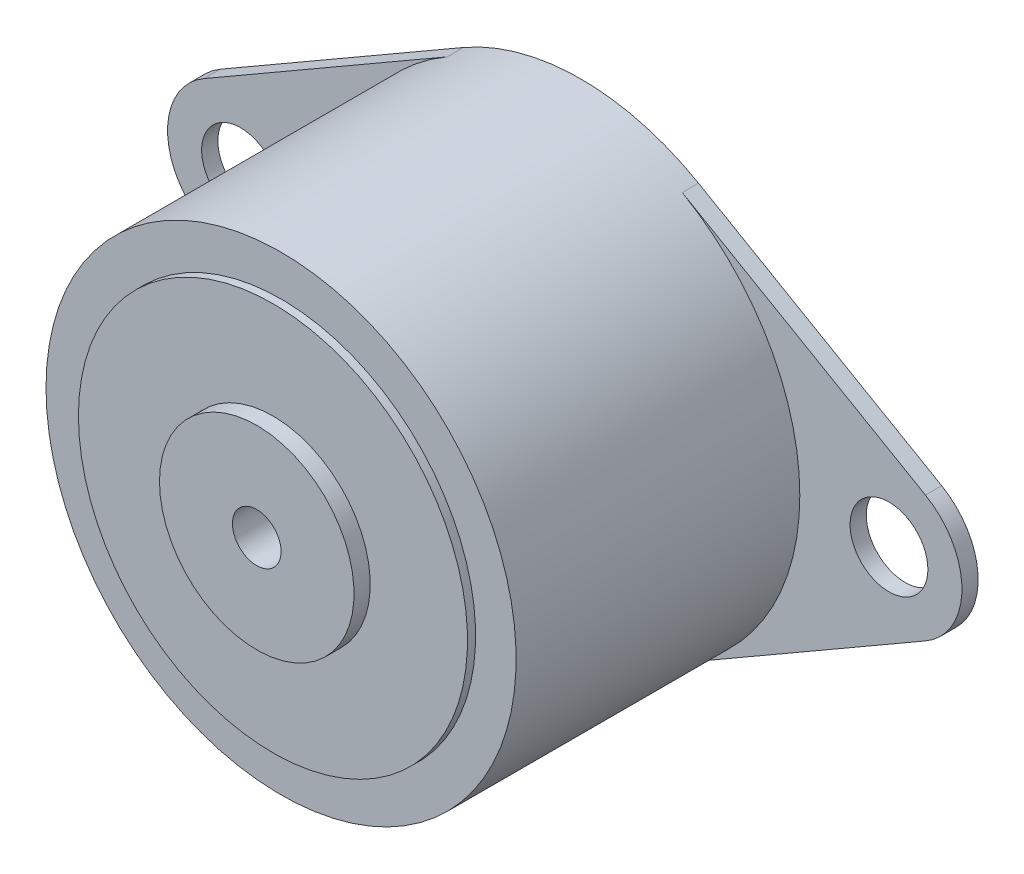
ISO-10303-21;
HEADER;
FILE_DESCRIPTION(('STEP AP214'),'2;1');
FILE_NAME('part.step','',(''),(''),'','','');
FILE_SCHEMA(('AUTOMOTIVE_DESIGN { 1 0 10303 214 1 1 1 1 }'));
ENDSEC;
DATA;
#1=APPLICATION_CONTEXT('core data for automotive mechanical design processes');
#2=APPLICATION_PROTOCOL_DEFINITION('international standard','automotive_design',2000,#1);
#3=PRODUCT_CONTEXT('',#1,'mechanical');
#4=PRODUCT('Part','Part','',(#3));
#5=PRODUCT_RELATED_PRODUCT_CATEGORY('part','',(#4));
#6=PRODUCT_DEFINITION_FORMATION('','',#4);
#7=PRODUCT_DEFINITION_CONTEXT('part definition',#1,'design');
#8=PRODUCT_DEFINITION('design','',#6,#7);
#9=PRODUCT_DEFINITION_SHAPE('','',#8);
#10=(LENGTH_UNIT() NAMED_UNIT(*) SI_UNIT(.MILLI.,.METRE.));
#11=(NAMED_UNIT(*) PLANE_ANGLE_UNIT() SI_UNIT($,.RADIAN.));
#12=(NAMED_UNIT(*) SI_UNIT($,.STERADIAN.) SOLID_ANGLE_UNIT());
#13=UNCERTAINTY_MEASURE_WITH_UNIT(LENGTH_MEASURE(1.E-05),#10,'distance_accuracy_value','');
#14=(GEOMETRIC_REPRESENTATION_CONTEXT(3) GLOBAL_UNCERTAINTY_ASSIGNED_CONTEXT((#13)) GLOBAL_UNIT_ASSIGNED_CONTEXT((#10,
#11,#12)) REPRESENTATION_CONTEXT('',''));
#15=CARTESIAN_POINT('',(0.,0.,0.));
#16=DIRECTION('',(0.,0.,1.));
#17=DIRECTION('',(1.,0.,0.));
#18=AXIS2_PLACEMENT_3D('',#15,#16,#17);
#19=CARTESIAN_POINT('',(0.,0.,0.));
#20=DIRECTION('',(0.,0.,-1.));
#21=DIRECTION('',(-1.00000000000001,0.,0.));
#22=AXIS2_PLACEMENT_3D('',#19,#20,#21);
#23=CYLINDRICAL_SURFACE('',#22,6.);
#24=CARTESIAN_POINT('',(0.,0.,9.50000000000006));
#25=DIRECTION('',(0.,0.,-1.));
#26=DIRECTION('',(-1.00000000000001,0.,0.));
#27=AXIS2_PLACEMENT_3D('',#24,#25,#26);
#28=CIRCLE('',#27,6.);
#29=CARTESIAN_POINT('',(-6.00000000000006,0.,9.50000000000006));
#30=VERTEX_POINT('',#29);
#31=EDGE_CURVE('E55',#30,#30,#28,.T.);
#32=ORIENTED_EDGE('',*,*,#31,.T.);
#33=EDGE_LOOP('',(#32));
#34=FACE_BOUND('',#33,.T.);
#35=CARTESIAN_POINT('',(0.,0.,9.25000000000006));
#36=DIRECTION('',(0.,0.,-1.));
#37=DIRECTION('',(-1.00000000000001,0.,0.));
#38=AXIS2_PLACEMENT_3D('',#35,#36,#37);
#39=CIRCLE('',#38,6.);
#40=CARTESIAN_POINT('',(-6.00000000000006,0.,9.25000000000006));
#41=VERTEX_POINT('',#40);
#42=EDGE_CURVE('E13',#41,#41,#39,.T.);
#43=ORIENTED_EDGE('',*,*,#42,.F.);
#44=EDGE_LOOP('',(#43));
#45=FACE_BOUND('',#44,.T.);
#46=ADVANCED_FACE('F46',(#34,#45),#23,.T.);
#47=CARTESIAN_POINT('',(-6.00000000000006,0.,9.50000000000006));
#48=DIRECTION('',(0.,0.,1.));
#49=DIRECTION('',(1.00000000000001,0.,0.));
#50=AXIS2_PLACEMENT_3D('',#47,#48,#49);
#51=PLANE('',#50);
#52=CARTESIAN_POINT('',(0.,0.,9.50000000000006));
#53=DIRECTION('',(0.,0.,-1.));
#54=DIRECTION('',(-1.00000000000001,0.,0.));
#55=AXIS2_PLACEMENT_3D('',#52,#53,#54);
#56=CIRCLE('',#55,3.);
#57=CARTESIAN_POINT('',(-3.00000000000003,0.,9.50000000000006));
#58=VERTEX_POINT('',#57);
#59=EDGE_CURVE('E212',#58,#58,#56,.T.);
#60=ORIENTED_EDGE('',*,*,#59,.T.);
#61=EDGE_LOOP('',(#60));
#62=FACE_BOUND('',#61,.T.);
#63=ORIENTED_EDGE('',*,*,#31,.F.);
#64=EDGE_LOOP('',(#63));
#65=FACE_BOUND('',#64,.T.);
#66=ADVANCED_FACE('F220',(#62,#65),#51,.T.);
#67=CARTESIAN_POINT('',(0.,0.,0.));
#68=DIRECTION('',(0.,0.,-1.));
#69=DIRECTION('',(-1.00000000000001,0.,0.));
#70=AXIS2_PLACEMENT_3D('',#67,#68,#69);
#71=CYLINDRICAL_SURFACE('',#70,3.);
#72=CARTESIAN_POINT('',(0.,0.,10.0000000000001));
#73=DIRECTION('',(0.,0.,-1.));
#74=DIRECTION('',(-1.00000000000001,0.,0.));
#75=AXIS2_PLACEMENT_3D('',#72,#73,#74);
#76=CIRCLE('',#75,3.);
#77=CARTESIAN_POINT('',(-3.00000000000003,0.,10.0000000000001));
#78=VERTEX_POINT('',#77);
#79=EDGE_CURVE('E209',#78,#78,#76,.T.);
#80=ORIENTED_EDGE('',*,*,#79,.T.);
#81=EDGE_LOOP('',(#80));
#82=FACE_BOUND('',#81,.T.);
#83=ORIENTED_EDGE('',*,*,#59,.F.);
#84=EDGE_LOOP('',(#83));
#85=FACE_BOUND('',#84,.T.);
#86=ADVANCED_FACE('F222',(#82,#85),#71,.T.);
#87=CARTESIAN_POINT('',(-3.00000000000003,0.,10.));
#88=DIRECTION('',(0.,0.,1.));
#89=DIRECTION('',(1.00000000000001,0.,0.));
#90=AXIS2_PLACEMENT_3D('',#87,#88,#89);
#91=PLANE('',#90);
#92=CARTESIAN_POINT('',(0.,0.,10.0000000000001));
#93=DIRECTION('',(0.,0.,-1.));
#94=DIRECTION('',(-1.00000000000001,0.,0.));
#95=AXIS2_PLACEMENT_3D('',#92,#93,#94);
#96=CIRCLE('',#95,0.749999999999999);
#97=CARTESIAN_POINT('',(-0.750000000000014,0.,10.0000000000001));
#98=VERTEX_POINT('',#97);
#99=EDGE_CURVE('E148',#98,#98,#96,.T.);
#100=ORIENTED_EDGE('',*,*,#99,.T.);
#101=EDGE_LOOP('',(#100));
#102=FACE_BOUND('',#101,.T.);
#103=ORIENTED_EDGE('',*,*,#79,.F.);
#104=EDGE_LOOP('',(#103));
#105=FACE_BOUND('',#104,.T.);
#106=ADVANCED_FACE('F228',(#102,#105),#91,.T.);
#107=CARTESIAN_POINT('',(0.,0.,0.));
#108=DIRECTION('',(0.,0.,-1.));
#109=DIRECTION('',(-1.00000000000001,0.,0.));
#110=AXIS2_PLACEMENT_3D('',#107,#108,#109);
#111=CYLINDRICAL_SURFACE('',#110,0.749999999999999);
#112=ORIENTED_EDGE('',*,*,#99,.F.);
#113=EDGE_LOOP('',(#112));
#114=FACE_BOUND('',#113,.T.);
#115=CARTESIAN_POINT('',(0.,0.,8.50000000000006));
#116=DIRECTION('',(0.,0.,1.));
#117=DIRECTION('',(1.00000000000001,0.,0.));
#118=AXIS2_PLACEMENT_3D('',#115,#116,#117);
#119=CIRCLE('',#118,0.75);
#120=CARTESIAN_POINT('',(0.749999999999992,0.,8.50000000000006));
#121=VERTEX_POINT('',#120);
#122=EDGE_CURVE('E301',#121,#121,#119,.T.);
#123=ORIENTED_EDGE('',*,*,#122,.F.);
#124=EDGE_LOOP('',(#123));
#125=FACE_BOUND('',#124,.T.);
#126=ADVANCED_FACE('F234',(#114,#125),#111,.F.);
#127=CARTESIAN_POINT('',(-6.00000000000007,0.,9.25000000000006));
#128=DIRECTION('',(0.,0.,-1.));
#129=DIRECTION('',(-1.00000000000001,0.,0.));
#130=AXIS2_PLACEMENT_3D('',#127,#128,#129);
#131=PLANE('',#130);
#132=ORIENTED_EDGE('',*,*,#42,.T.);
#133=EDGE_LOOP('',(#132));
#134=FACE_BOUND('',#133,.T.);
#135=CARTESIAN_POINT('',(0.,0.,9.25000000000006));
#136=DIRECTION('',(0.,0.,-1.));
#137=DIRECTION('',(-1.00000000000001,0.,0.));
#138=AXIS2_PLACEMENT_3D('',#135,#136,#137);
#139=CIRCLE('',#138,7.25);
#140=CARTESIAN_POINT('',(-7.25000000000007,0.,9.25000000000006));
#141=VERTEX_POINT('',#140);
#142=EDGE_CURVE('E144',#141,#141,#139,.T.);
#143=ORIENTED_EDGE('',*,*,#142,.F.);
#144=EDGE_LOOP('',(#143));
#145=FACE_BOUND('',#144,.T.);
#146=ADVANCED_FACE('F238',(#134,#145),#131,.F.);
#147=CARTESIAN_POINT('',(0.,0.,29.7560966544099));
#148=DIRECTION('',(0.,0.,-1.));
#149=DIRECTION('',(-1.00000000000001,0.,0.));
#150=AXIS2_PLACEMENT_3D('',#147,#148,#149);
#151=CYLINDRICAL_SURFACE('',#150,7.25);
#152=ORIENTED_EDGE('',*,*,#142,.T.);
#153=EDGE_LOOP('',(#152));
#154=FACE_BOUND('',#153,.T.);
#155=CARTESIAN_POINT('',(0.,0.,0.));
#156=DIRECTION('',(0.,0.,1.));
#157=DIRECTION('',(-1.00000000000001,0.,0.));
#158=AXIS2_PLACEMENT_3D('',#155,#156,#157);
#159=CIRCLE('',#158,7.25);
#160=CARTESIAN_POINT('',(-3.62500000000003,-6.27868417743719,0.));
#161=VERTEX_POINT('',#160);
#162=CARTESIAN_POINT('',(3.62500000000001,-6.27868417743718,0.));
#163=VERTEX_POINT('',#162);
#164=EDGE_CURVE('E93',#161,#163,#159,.T.);
#165=ORIENTED_EDGE('',*,*,#164,.T.);
#166=DIRECTION('',(0.,0.,-1.));
#167=VECTOR('',#166,1.);
#168=CARTESIAN_POINT('',(3.62500000000001,-6.27868417743718,0.5));
#169=LINE('',#168,#167);
#170=CARTESIAN_POINT('',(3.62500000000001,-6.27868417743718,0.5));
#171=VERTEX_POINT('',#170);
#172=EDGE_CURVE('E138',#171,#163,#169,.T.);
#173=ORIENTED_EDGE('',*,*,#172,.F.);
#174=CARTESIAN_POINT('',(0.,0.,0.5));
#175=DIRECTION('',(0.,0.,1.));
#176=DIRECTION('',(1.00000000000001,0.,0.));
#177=AXIS2_PLACEMENT_3D('',#174,#175,#176);
#178=CIRCLE('',#177,7.25);
#179=CARTESIAN_POINT('',(3.62500000000001,6.27868417743726,0.500000000000056));
#180=VERTEX_POINT('',#179);
#181=EDGE_CURVE('E145',#171,#180,#178,.T.);
#182=ORIENTED_EDGE('',*,*,#181,.T.);
#183=DIRECTION('',(0.,0.,-1.));
#184=VECTOR('',#183,1.);
#185=CARTESIAN_POINT('',(3.62500000000001,6.27868417743726,0.500000000000056));
#186=LINE('',#185,#184);
#187=CARTESIAN_POINT('',(3.625,6.27868417743725,0.));
#188=VERTEX_POINT('',#187);
#189=EDGE_CURVE('E162',#180,#188,#186,.T.);
#190=ORIENTED_EDGE('',*,*,#189,.T.);
#191=CARTESIAN_POINT('',(0.,0.,0.));
#192=DIRECTION('',(0.,0.,1.));
#193=DIRECTION('',(1.00000000000001,0.,0.));
#194=AXIS2_PLACEMENT_3D('',#191,#192,#193);
#195=CIRCLE('',#194,7.25);
#196=CARTESIAN_POINT('',(-3.62500000000005,6.27868417743726,1.17961196366423E-13));
#197=VERTEX_POINT('',#196);
#198=EDGE_CURVE('E322',#188,#197,#195,.T.);
#199=ORIENTED_EDGE('',*,*,#198,.T.);
#200=DIRECTION('',(0.,0.,-1.));
#201=VECTOR('',#200,1.);
#202=CARTESIAN_POINT('',(-3.62500000000004,6.27868417743724,0.500000000000118));
#203=LINE('',#202,#201);
#204=CARTESIAN_POINT('',(-3.62500000000004,6.27868417743724,0.500000000000118));
#205=VERTEX_POINT('',#204);
#206=EDGE_CURVE('E142',#205,#197,#203,.T.);
#207=ORIENTED_EDGE('',*,*,#206,.F.);
#208=CARTESIAN_POINT('',(-3.62500000000004,-6.27868417743719,0.5));
#209=VERTEX_POINT('',#208);
#210=EDGE_CURVE('E125',#205,#209,#178,.T.);
#211=ORIENTED_EDGE('',*,*,#210,.T.);
#212=DIRECTION('',(0.,0.,-1.));
#213=VECTOR('',#212,1.);
#214=CARTESIAN_POINT('',(-3.62500000000004,-6.27868417743719,0.5));
#215=LINE('',#214,#213);
#216=EDGE_CURVE('E133',#209,#161,#215,.T.);
#217=ORIENTED_EDGE('',*,*,#216,.T.);
#218=EDGE_LOOP('',(#165,#173,#182,#190,#199,#207,#211,#217));
#219=FACE_BOUND('',#218,.T.);
#220=ADVANCED_FACE('F140',(#154,#219),#151,.T.);
#221=CARTESIAN_POINT('',(-10.0000000000001,0.,0.500000000000056));
#222=DIRECTION('',(0.,0.,1.));
#223=DIRECTION('',(1.00000000000001,0.,0.));
#224=AXIS2_PLACEMENT_3D('',#221,#222,#223);
#225=CYLINDRICAL_SURFACE('',#224,1.2);
#226=CARTESIAN_POINT('',(-10.0000000000001,0.,0.));
#227=DIRECTION('',(0.,0.,-1.));
#228=DIRECTION('',(-1.00000000000001,0.,0.));
#229=AXIS2_PLACEMENT_3D('',#226,#227,#228);
#230=CIRCLE('',#229,1.2);
#231=CARTESIAN_POINT('',(-11.2000000000001,0.,0.));
#232=VERTEX_POINT('',#231);
#233=EDGE_CURVE('E203',#232,#232,#230,.T.);
#234=ORIENTED_EDGE('',*,*,#233,.T.);
#235=EDGE_LOOP('',(#234));
#236=FACE_BOUND('',#235,.T.);
#237=CARTESIAN_POINT('',(-10.0000000000001,0.,0.500000000000056));
#238=DIRECTION('',(0.,0.,1.));
#239=DIRECTION('',(1.00000000000001,0.,0.));
#240=AXIS2_PLACEMENT_3D('',#237,#238,#239);
#241=CIRCLE('',#240,1.2);
#242=CARTESIAN_POINT('',(-8.80000000000009,0.,0.500000000000056));
#243=VERTEX_POINT('',#242);
#244=EDGE_CURVE('E205',#243,#243,#241,.T.);
#245=ORIENTED_EDGE('',*,*,#244,.T.);
#246=EDGE_LOOP('',(#245));
#247=FACE_BOUND('',#246,.T.);
#248=ADVANCED_FACE('F242',(#236,#247),#225,.F.);
#249=CARTESIAN_POINT('',(10.,0.,0.500000000000063));
#250=DIRECTION('',(0.,0.,1.));
#251=DIRECTION('',(1.00000000000001,0.,0.));
#252=AXIS2_PLACEMENT_3D('',#249,#250,#251);
#253=CYLINDRICAL_SURFACE('',#252,1.2);
#254=CARTESIAN_POINT('',(10.0000000000001,0.,0.));
#255=DIRECTION('',(0.,0.,-1.));
#256=DIRECTION('',(-1.00000000000001,0.,0.));
#257=AXIS2_PLACEMENT_3D('',#254,#255,#256);
#258=CIRCLE('',#257,1.2);
#259=CARTESIAN_POINT('',(8.80000000000005,0.,0.));
#260=VERTEX_POINT('',#259);
#261=EDGE_CURVE('E198',#260,#260,#258,.T.);
#262=ORIENTED_EDGE('',*,*,#261,.T.);
#263=EDGE_LOOP('',(#262));
#264=FACE_BOUND('',#263,.T.);
#265=CARTESIAN_POINT('',(10.,0.,0.500000000000063));
#266=DIRECTION('',(0.,0.,1.));
#267=DIRECTION('',(1.00000000000001,0.,0.));
#268=AXIS2_PLACEMENT_3D('',#265,#266,#267);
#269=CIRCLE('',#268,1.2);
#270=CARTESIAN_POINT('',(11.2000000000001,0.,0.500000000000063));
#271=VERTEX_POINT('',#270);
#272=EDGE_CURVE('E202',#271,#271,#269,.T.);
#273=ORIENTED_EDGE('',*,*,#272,.T.);
#274=EDGE_LOOP('',(#273));
#275=FACE_BOUND('',#274,.T.);
#276=ADVANCED_FACE('F274',(#264,#275),#253,.F.);
#277=CARTESIAN_POINT('',(10.0000000000001,0.,0.));
#278=DIRECTION('',(0.,0.,-1.));
#279=DIRECTION('',(-1.00000000000001,0.,0.));
#280=AXIS2_PLACEMENT_3D('',#277,#278,#279);
#281=PLANE('',#280);
#282=CARTESIAN_POINT('',(0.,0.,0.));
#283=DIRECTION('',(0.,0.,-1.));
#284=DIRECTION('',(-1.00000000000001,0.,0.));
#285=AXIS2_PLACEMENT_3D('',#282,#283,#284);
#286=CIRCLE('',#285,0.75);
#287=CARTESIAN_POINT('',(-0.750000000000006,0.,0.));
#288=VERTEX_POINT('',#287);
#289=EDGE_CURVE('E298',#288,#288,#286,.T.);
#290=ORIENTED_EDGE('',*,*,#289,.F.);
#291=EDGE_LOOP('',(#290));
#292=FACE_BOUND('',#291,.T.);
#293=ORIENTED_EDGE('',*,*,#233,.F.);
#294=EDGE_LOOP('',(#293));
#295=FACE_BOUND('',#294,.T.);
#296=ORIENTED_EDGE('',*,*,#261,.F.);
#297=EDGE_LOOP('',(#296));
#298=FACE_BOUND('',#297,.T.);
#299=CARTESIAN_POINT('',(10.0000000000001,0.,0.));
#300=DIRECTION('',(0.,0.,1.));
#301=DIRECTION('',(-1.00000000000001,0.,0.));
#302=AXIS2_PLACEMENT_3D('',#299,#300,#301);
#303=CIRCLE('',#302,2.25);
#304=CARTESIAN_POINT('',(11.1250000000001,-1.94855715851497,0.));
#305=VERTEX_POINT('',#304);
#306=CARTESIAN_POINT('',(11.1250000000001,1.94855715851504,0.));
#307=VERTEX_POINT('',#306);
#308=EDGE_CURVE('E313',#305,#307,#303,.T.);
#309=ORIENTED_EDGE('',*,*,#308,.F.);
#310=DIRECTION('',(0.866025403784445,0.500000000000004,0.));
#311=VECTOR('',#310,1.);
#312=CARTESIAN_POINT('',(11.1250000000001,-1.94855715851497,0.));
#313=LINE('',#312,#311);
#314=EDGE_CURVE('E99',#163,#305,#313,.T.);
#315=ORIENTED_EDGE('',*,*,#314,.F.);
#316=ORIENTED_EDGE('',*,*,#164,.F.);
#317=DIRECTION('',(0.866025403784445,-0.500000000000004,0.));
#318=VECTOR('',#317,1.);
#319=CARTESIAN_POINT('',(-11.1250000000001,-1.94855715851498,0.));
#320=LINE('',#319,#318);
#321=CARTESIAN_POINT('',(-11.1250000000001,-1.94855715851498,0.));
#322=VERTEX_POINT('',#321);
#323=EDGE_CURVE('E136',#322,#161,#320,.T.);
#324=ORIENTED_EDGE('',*,*,#323,.F.);
#325=CARTESIAN_POINT('',(-10.0000000000001,0.,0.));
#326=DIRECTION('',(0.,0.,1.));
#327=DIRECTION('',(1.00000000000001,0.,0.));
#328=AXIS2_PLACEMENT_3D('',#325,#326,#327);
#329=CIRCLE('',#328,2.25);
#330=CARTESIAN_POINT('',(-11.1250000000001,1.94855715851502,0.));
#331=VERTEX_POINT('',#330);
#332=EDGE_CURVE('E326',#331,#322,#329,.T.);
#333=ORIENTED_EDGE('',*,*,#332,.F.);
#334=DIRECTION('',(-0.866025403784445,-0.500000000000004,0.));
#335=VECTOR('',#334,1.);
#336=CARTESIAN_POINT('',(-11.1250000000001,1.94855715851502,0.));
#337=LINE('',#336,#335);
#338=EDGE_CURVE('E324',#197,#331,#337,.T.);
#339=ORIENTED_EDGE('',*,*,#338,.F.);
#340=ORIENTED_EDGE('',*,*,#198,.F.);
#341=DIRECTION('',(-0.866025403784445,0.500000000000004,0.));
#342=VECTOR('',#341,1.);
#343=CARTESIAN_POINT('',(11.1250000000001,1.94855715851504,0.));
#344=LINE('',#343,#342);
#345=EDGE_CURVE('E320',#307,#188,#344,.T.);
#346=ORIENTED_EDGE('',*,*,#345,.F.);
#347=EDGE_LOOP('',(#309,#315,#316,#324,#333,#339,#340,#346));
#348=FACE_BOUND('',#347,.T.);
#349=ADVANCED_FACE('F271',(#292,#295,#298,#348),#281,.T.);
#350=CARTESIAN_POINT('',(11.1250000000001,-1.94855715851495,0.500000000000063));
#351=DIRECTION('',(-0.500000000000004,0.866025403784445,0.));
#352=DIRECTION('',(-0.866025403784445,-0.500000000000004,0.));
#353=AXIS2_PLACEMENT_3D('',#350,#351,#352);
#354=PLANE('',#353);
#355=ORIENTED_EDGE('',*,*,#314,.T.);
#356=DIRECTION('',(0.,0.,-1.));
#357=VECTOR('',#356,1.);
#358=CARTESIAN_POINT('',(11.1250000000001,-1.94855715851495,0.500000000000063));
#359=LINE('',#358,#357);
#360=CARTESIAN_POINT('',(11.1250000000001,-1.94855715851495,0.500000000000063));
#361=VERTEX_POINT('',#360);
#362=EDGE_CURVE('E170',#361,#305,#359,.T.);
#363=ORIENTED_EDGE('',*,*,#362,.F.);
#364=DIRECTION('',(0.866025403784445,0.500000000000004,0.));
#365=VECTOR('',#364,1.);
#366=CARTESIAN_POINT('',(11.1250000000001,-1.94855715851495,0.500000000000063));
#367=LINE('',#366,#365);
#368=EDGE_CURVE('E63',#171,#361,#367,.T.);
#369=ORIENTED_EDGE('',*,*,#368,.F.);
#370=ORIENTED_EDGE('',*,*,#172,.T.);
#371=EDGE_LOOP('',(#355,#363,#369,#370));
#372=FACE_BOUND('',#371,.T.);
#373=ADVANCED_FACE('F268',(#372),#354,.F.);
#374=CARTESIAN_POINT('',(-11.1250000000001,-1.94855715851497,0.500000000000056));
#375=DIRECTION('',(0.500000000000004,0.866025403784445,0.));
#376=DIRECTION('',(-0.866025403784445,0.500000000000004,0.));
#377=AXIS2_PLACEMENT_3D('',#374,#375,#376);
#378=PLANE('',#377);
#379=ORIENTED_EDGE('',*,*,#323,.T.);
#380=ORIENTED_EDGE('',*,*,#216,.F.);
#381=DIRECTION('',(0.866025403784445,-0.500000000000004,0.));
#382=VECTOR('',#381,1.);
#383=CARTESIAN_POINT('',(-11.1250000000001,-1.94855715851497,0.500000000000056));
#384=LINE('',#383,#382);
#385=CARTESIAN_POINT('',(-11.1250000000001,-1.94855715851497,0.500000000000056));
#386=VERTEX_POINT('',#385);
#387=EDGE_CURVE('E121',#386,#209,#384,.T.);
#388=ORIENTED_EDGE('',*,*,#387,.F.);
#389=DIRECTION('',(0.,0.,-1.));
#390=VECTOR('',#389,1.);
#391=CARTESIAN_POINT('',(-11.1250000000001,-1.94855715851497,0.500000000000056));
#392=LINE('',#391,#390);
#393=EDGE_CURVE('E137',#386,#322,#392,.T.);
#394=ORIENTED_EDGE('',*,*,#393,.T.);
#395=EDGE_LOOP('',(#379,#380,#388,#394));
#396=FACE_BOUND('',#395,.T.);
#397=ADVANCED_FACE('F134',(#396),#378,.F.);
#398=CARTESIAN_POINT('',(-10.0000000000001,0.,0.500000000000056));
#399=DIRECTION('',(0.,0.,-1.));
#400=DIRECTION('',(-1.00000000000001,0.,0.));
#401=AXIS2_PLACEMENT_3D('',#398,#399,#400);
#402=CYLINDRICAL_SURFACE('',#401,2.25);
#403=ORIENTED_EDGE('',*,*,#332,.T.);
#404=ORIENTED_EDGE('',*,*,#393,.F.);
#405=CARTESIAN_POINT('',(-10.0000000000001,0.,0.500000000000056));
#406=DIRECTION('',(0.,0.,1.));
#407=DIRECTION('',(1.00000000000001,0.,0.));
#408=AXIS2_PLACEMENT_3D('',#405,#406,#407);
#409=CIRCLE('',#408,2.25);
#410=CARTESIAN_POINT('',(-11.1250000000001,1.94855715851502,0.500000000000056));
#411=VERTEX_POINT('',#410);
#412=EDGE_CURVE('E128',#411,#386,#409,.T.);
#413=ORIENTED_EDGE('',*,*,#412,.F.);
#414=DIRECTION('',(0.,0.,-1.));
#415=VECTOR('',#414,1.);
#416=CARTESIAN_POINT('',(-11.1250000000001,1.94855715851502,0.500000000000056));
#417=LINE('',#416,#415);
#418=EDGE_CURVE('E180',#411,#331,#417,.T.);
#419=ORIENTED_EDGE('',*,*,#418,.T.);
#420=EDGE_LOOP('',(#403,#404,#413,#419));
#421=FACE_BOUND('',#420,.T.);
#422=ADVANCED_FACE('F263',(#421),#402,.T.);
#423=CARTESIAN_POINT('',(-11.1250000000001,1.94855715851502,0.500000000000056));
#424=DIRECTION('',(0.500000000000004,-0.866025403784445,0.));
#425=DIRECTION('',(0.866025403784445,0.500000000000004,0.));
#426=AXIS2_PLACEMENT_3D('',#423,#424,#425);
#427=PLANE('',#426);
#428=ORIENTED_EDGE('',*,*,#338,.T.);
#429=ORIENTED_EDGE('',*,*,#418,.F.);
#430=DIRECTION('',(-0.866025403784445,-0.500000000000004,0.));
#431=VECTOR('',#430,1.);
#432=CARTESIAN_POINT('',(-11.1250000000001,1.94855715851502,0.500000000000056));
#433=LINE('',#432,#431);
#434=EDGE_CURVE('E194',#205,#411,#433,.T.);
#435=ORIENTED_EDGE('',*,*,#434,.F.);
#436=ORIENTED_EDGE('',*,*,#206,.T.);
#437=EDGE_LOOP('',(#428,#429,#435,#436));
#438=FACE_BOUND('',#437,.T.);
#439=ADVANCED_FACE('F260',(#438),#427,.F.);
#440=CARTESIAN_POINT('',(11.1250000000001,1.94855715851502,0.5));
#441=DIRECTION('',(-0.500000000000004,-0.866025403784445,0.));
#442=DIRECTION('',(0.866025403784445,-0.500000000000004,0.));
#443=AXIS2_PLACEMENT_3D('',#440,#441,#442);
#444=PLANE('',#443);
#445=ORIENTED_EDGE('',*,*,#345,.T.);
#446=ORIENTED_EDGE('',*,*,#189,.F.);
#447=DIRECTION('',(-0.866025403784445,0.500000000000004,0.));
#448=VECTOR('',#447,1.);
#449=CARTESIAN_POINT('',(11.1250000000001,1.94855715851502,0.5));
#450=LINE('',#449,#448);
#451=CARTESIAN_POINT('',(11.1250000000001,1.94855715851502,0.5));
#452=VERTEX_POINT('',#451);
#453=EDGE_CURVE('E108',#452,#180,#450,.T.);
#454=ORIENTED_EDGE('',*,*,#453,.F.);
#455=DIRECTION('',(0.,0.,-1.));
#456=VECTOR('',#455,1.);
#457=CARTESIAN_POINT('',(11.1250000000001,1.94855715851502,0.5));
#458=LINE('',#457,#456);
#459=EDGE_CURVE('E151',#452,#307,#458,.T.);
#460=ORIENTED_EDGE('',*,*,#459,.T.);
#461=EDGE_LOOP('',(#445,#446,#454,#460));
#462=FACE_BOUND('',#461,.T.);
#463=ADVANCED_FACE('F257',(#462),#444,.F.);
#464=CARTESIAN_POINT('',(10.,0.,0.500000000000063));
#465=DIRECTION('',(0.,0.,-1.));
#466=DIRECTION('',(-1.00000000000001,0.,0.));
#467=AXIS2_PLACEMENT_3D('',#464,#465,#466);
#468=CYLINDRICAL_SURFACE('',#467,2.25);
#469=ORIENTED_EDGE('',*,*,#308,.T.);
#470=ORIENTED_EDGE('',*,*,#459,.F.);
#471=CARTESIAN_POINT('',(10.,0.,0.500000000000063));
#472=DIRECTION('',(0.,0.,1.));
#473=DIRECTION('',(-1.00000000000001,0.,0.));
#474=AXIS2_PLACEMENT_3D('',#471,#472,#473);
#475=CIRCLE('',#474,2.25);
#476=EDGE_CURVE('E316',#361,#452,#475,.T.);
#477=ORIENTED_EDGE('',*,*,#476,.F.);
#478=ORIENTED_EDGE('',*,*,#362,.T.);
#479=EDGE_LOOP('',(#469,#470,#477,#478));
#480=FACE_BOUND('',#479,.T.);
#481=ADVANCED_FACE('F253',(#480),#468,.T.);
#482=CARTESIAN_POINT('',(10.,0.,0.500000000000063));
#483=DIRECTION('',(0.,0.,-1.));
#484=DIRECTION('',(-1.00000000000001,0.,0.));
#485=AXIS2_PLACEMENT_3D('',#482,#483,#484);
#486=PLANE('',#485);
#487=ORIENTED_EDGE('',*,*,#272,.F.);
#488=EDGE_LOOP('',(#487));
#489=FACE_BOUND('',#488,.T.);
#490=ORIENTED_EDGE('',*,*,#181,.F.);
#491=ORIENTED_EDGE('',*,*,#368,.T.);
#492=ORIENTED_EDGE('',*,*,#476,.T.);
#493=ORIENTED_EDGE('',*,*,#453,.T.);
#494=EDGE_LOOP('',(#490,#491,#492,#493));
#495=FACE_BOUND('',#494,.T.);
#496=ADVANCED_FACE('F256',(#489,#495),#486,.F.);
#497=ORIENTED_EDGE('',*,*,#244,.F.);
#498=EDGE_LOOP('',(#497));
#499=FACE_BOUND('',#498,.T.);
#500=ORIENTED_EDGE('',*,*,#210,.F.);
#501=ORIENTED_EDGE('',*,*,#434,.T.);
#502=ORIENTED_EDGE('',*,*,#412,.T.);
#503=ORIENTED_EDGE('',*,*,#387,.T.);
#504=EDGE_LOOP('',(#500,#501,#502,#503));
#505=FACE_BOUND('',#504,.T.);
#506=ADVANCED_FACE('F123',(#499,#505),#486,.F.);
#507=CARTESIAN_POINT('',(0.,0.,10.0000000000001));
#508=DIRECTION('',(0.,0.,-1.));
#509=DIRECTION('',(-1.00000000000001,0.,0.));
#510=AXIS2_PLACEMENT_3D('',#507,#508,#509);
#511=CYLINDRICAL_SURFACE('',#510,0.75);
#512=ORIENTED_EDGE('',*,*,#289,.T.);
#513=EDGE_LOOP('',(#512));
#514=FACE_BOUND('',#513,.T.);
#515=CARTESIAN_POINT('',(0.,0.,0.5));
#516=DIRECTION('',(0.,0.,-1.));
#517=DIRECTION('',(-1.00000000000001,0.,0.));
#518=AXIS2_PLACEMENT_3D('',#515,#516,#517);
#519=CIRCLE('',#518,0.75);
#520=CARTESIAN_POINT('',(-0.75000000000002,0.,0.5));
#521=VERTEX_POINT('',#520);
#522=EDGE_CURVE('E49',#521,#521,#519,.T.);
#523=ORIENTED_EDGE('',*,*,#522,.F.);
#524=EDGE_LOOP('',(#523));
#525=FACE_BOUND('',#524,.T.);
#526=ADVANCED_FACE('F248',(#514,#525),#511,.F.);
#527=CARTESIAN_POINT('',(0.,0.,8.50000000000006));
#528=DIRECTION('',(0.,0.,1.));
#529=DIRECTION('',(1.00000000000001,0.,0.));
#530=AXIS2_PLACEMENT_3D('',#527,#528,#529);
#531=PLANE('',#530);
#532=ORIENTED_EDGE('',*,*,#122,.T.);
#533=EDGE_LOOP('',(#532));
#534=FACE_BOUND('',#533,.T.);
#535=CARTESIAN_POINT('',(0.,0.,8.50000000000006));
#536=DIRECTION('',(0.,0.,1.));
#537=DIRECTION('',(1.00000000000001,0.,0.));
#538=AXIS2_PLACEMENT_3D('',#535,#536,#537);
#539=CIRCLE('',#538,7.);
#540=CARTESIAN_POINT('',(7.00000000000004,0.,8.50000000000006));
#541=VERTEX_POINT('',#540);
#542=EDGE_CURVE('E310',#541,#541,#539,.T.);
#543=ORIENTED_EDGE('',*,*,#542,.F.);
#544=EDGE_LOOP('',(#543));
#545=FACE_BOUND('',#544,.T.);
#546=ADVANCED_FACE('F244',(#534,#545),#531,.F.);
#547=CARTESIAN_POINT('',(0.,0.,8.50000000000006));
#548=DIRECTION('',(0.,0.,-1.));
#549=DIRECTION('',(-1.00000000000001,0.,0.));
#550=AXIS2_PLACEMENT_3D('',#547,#548,#549);
#551=CYLINDRICAL_SURFACE('',#550,7.);
#552=ORIENTED_EDGE('',*,*,#542,.T.);
#553=EDGE_LOOP('',(#552));
#554=FACE_BOUND('',#553,.T.);
#555=CARTESIAN_POINT('',(0.,0.,0.5));
#556=DIRECTION('',(0.,0.,1.));
#557=DIRECTION('',(1.00000000000001,0.,0.));
#558=AXIS2_PLACEMENT_3D('',#555,#556,#557);
#559=CIRCLE('',#558,7.);
#560=CARTESIAN_POINT('',(7.00000000000004,0.,0.5));
#561=VERTEX_POINT('',#560);
#562=EDGE_CURVE('E201',#561,#561,#559,.T.);
#563=ORIENTED_EDGE('',*,*,#562,.F.);
#564=EDGE_LOOP('',(#563));
#565=FACE_BOUND('',#564,.T.);
#566=ADVANCED_FACE('F247',(#554,#565),#551,.F.);
#567=ORIENTED_EDGE('',*,*,#522,.T.);
#568=EDGE_LOOP('',(#567));
#569=FACE_BOUND('',#568,.T.);
#570=ORIENTED_EDGE('',*,*,#562,.T.);
#571=EDGE_LOOP('',(#570));
#572=FACE_BOUND('',#571,.T.);
#573=ADVANCED_FACE('F276',(#569,#572),#486,.F.);
#574=CLOSED_SHELL('',(#46,#66,#86,#106,#126,#146,#220,#248,#276,#349,#373,#397,#422,#439,#463,
#481,#496,#506,#526,#546,#566,#573));
#575=MANIFOLD_SOLID_BREP('B2',#574);
#576=ADVANCED_BREP_SHAPE_REPRESENTATION('',(#18,#575),#14);
#577=SHAPE_DEFINITION_REPRESENTATION(#9,#576);
ENDSEC;
END-ISO-10303-21;
